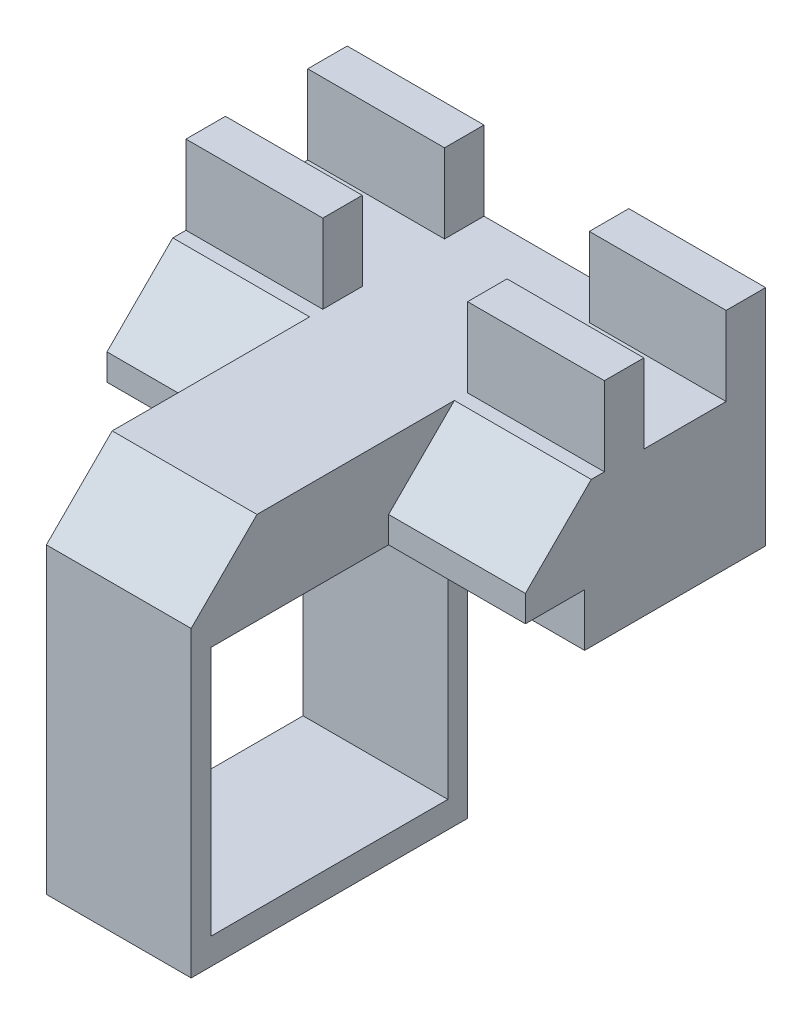
ISO-10303-21;
HEADER;
FILE_DESCRIPTION(('STEP AP214'),'2;1');
FILE_NAME('part.step','',(''),(''),'','','');
FILE_SCHEMA(('AUTOMOTIVE_DESIGN { 1 0 10303 214 1 1 1 1 }'));
ENDSEC;
DATA;
#1=APPLICATION_CONTEXT('core data for automotive mechanical design processes');
#2=APPLICATION_PROTOCOL_DEFINITION('international standard','automotive_design',2000,#1);
#3=PRODUCT_CONTEXT('',#1,'mechanical');
#4=PRODUCT('Part','Part','',(#3));
#5=PRODUCT_RELATED_PRODUCT_CATEGORY('part','',(#4));
#6=PRODUCT_DEFINITION_FORMATION('','',#4);
#7=PRODUCT_DEFINITION_CONTEXT('part definition',#1,'design');
#8=PRODUCT_DEFINITION('design','',#6,#7);
#9=PRODUCT_DEFINITION_SHAPE('','',#8);
#10=(LENGTH_UNIT() NAMED_UNIT(*) SI_UNIT(.MILLI.,.METRE.));
#11=(NAMED_UNIT(*) PLANE_ANGLE_UNIT() SI_UNIT($,.RADIAN.));
#12=(NAMED_UNIT(*) SI_UNIT($,.STERADIAN.) SOLID_ANGLE_UNIT());
#13=UNCERTAINTY_MEASURE_WITH_UNIT(LENGTH_MEASURE(1.E-05),#10,'distance_accuracy_value','');
#14=(GEOMETRIC_REPRESENTATION_CONTEXT(3) GLOBAL_UNCERTAINTY_ASSIGNED_CONTEXT((#13)) GLOBAL_UNIT_ASSIGNED_CONTEXT((#10,
#11,#12)) REPRESENTATION_CONTEXT('',''));
#15=CARTESIAN_POINT('',(0.,0.,0.));
#16=DIRECTION('',(0.,0.,1.));
#17=DIRECTION('',(1.,0.,0.));
#18=AXIS2_PLACEMENT_3D('',#15,#16,#17);
#19=CARTESIAN_POINT('',(43.7350442610288,23.,0.));
#20=DIRECTION('',(1.,0.,0.));
#21=DIRECTION('',(0.,0.,-1.));
#22=AXIS2_PLACEMENT_3D('',#19,#20,#21);
#23=PLANE('',#22);
#24=DIRECTION('',(0.,-1.,0.));
#25=VECTOR('',#24,1.);
#26=CARTESIAN_POINT('',(43.7350442610288,23.,12.5));
#27=LINE('',#26,#25);
#28=CARTESIAN_POINT('',(43.7350442610288,23.,12.5));
#29=VERTEX_POINT('',#28);
#30=CARTESIAN_POINT('',(43.7350442610288,11.,12.5));
#31=VERTEX_POINT('',#30);
#32=EDGE_CURVE('E318',#29,#31,#27,.T.);
#33=ORIENTED_EDGE('',*,*,#32,.T.);
#34=DIRECTION('',(0.,0.,-1.));
#35=VECTOR('',#34,1.);
#36=CARTESIAN_POINT('',(43.7350442610288,11.,18.5));
#37=LINE('',#36,#35);
#38=CARTESIAN_POINT('',(43.7350442610288,11.,18.5));
#39=VERTEX_POINT('',#38);
#40=EDGE_CURVE('E309',#39,#31,#37,.T.);
#41=ORIENTED_EDGE('',*,*,#40,.F.);
#42=DIRECTION('',(0.,-1.,0.));
#43=VECTOR('',#42,1.);
#44=CARTESIAN_POINT('',(43.7350442610288,23.,18.5));
#45=LINE('',#44,#43);
#46=CARTESIAN_POINT('',(43.7350442610288,23.,18.5));
#47=VERTEX_POINT('',#46);
#48=EDGE_CURVE('E308',#47,#39,#45,.T.);
#49=ORIENTED_EDGE('',*,*,#48,.F.);
#50=DIRECTION('',(0.,0.,1.));
#51=VECTOR('',#50,1.);
#52=CARTESIAN_POINT('',(43.7350442610288,23.,0.));
#53=LINE('',#52,#51);
#54=EDGE_CURVE('E325',#29,#47,#53,.T.);
#55=ORIENTED_EDGE('',*,*,#54,.F.);
#56=EDGE_LOOP('',(#33,#41,#49,#55));
#57=FACE_BOUND('',#56,.T.);
#58=ADVANCED_FACE('F71',(#57),#23,.F.);
#59=DIRECTION('',(0.,1.,0.));
#60=VECTOR('',#59,1.);
#61=CARTESIAN_POINT('',(43.7350442610288,-11.,-6.));
#62=LINE('',#61,#60);
#63=CARTESIAN_POINT('',(43.7350442610288,11.,-6.));
#64=VERTEX_POINT('',#63);
#65=CARTESIAN_POINT('',(43.7350442610288,23.,-6.));
#66=VERTEX_POINT('',#65);
#67=EDGE_CURVE('E389',#64,#66,#62,.T.);
#68=ORIENTED_EDGE('',*,*,#67,.F.);
#69=DIRECTION('',(0.,0.,-1.));
#70=VECTOR('',#69,1.);
#71=CARTESIAN_POINT('',(43.7350442610288,11.,0.));
#72=LINE('',#71,#70);
#73=CARTESIAN_POINT('',(43.7350442610288,11.,0.));
#74=VERTEX_POINT('',#73);
#75=EDGE_CURVE('E544',#74,#64,#72,.T.);
#76=ORIENTED_EDGE('',*,*,#75,.F.);
#77=DIRECTION('',(0.,-1.,0.));
#78=VECTOR('',#77,1.);
#79=CARTESIAN_POINT('',(43.7350442610288,23.,0.));
#80=LINE('',#79,#78);
#81=CARTESIAN_POINT('',(43.7350442610288,23.,0.));
#82=VERTEX_POINT('',#81);
#83=EDGE_CURVE('E599',#82,#74,#80,.T.);
#84=ORIENTED_EDGE('',*,*,#83,.F.);
#85=DIRECTION('',(0.,0.,1.));
#86=VECTOR('',#85,1.);
#87=CARTESIAN_POINT('',(43.7350442610288,23.,0.));
#88=LINE('',#87,#86);
#89=EDGE_CURVE('E578',#66,#82,#88,.T.);
#90=ORIENTED_EDGE('',*,*,#89,.F.);
#91=EDGE_LOOP('',(#68,#76,#84,#90));
#92=FACE_BOUND('',#91,.T.);
#93=ADVANCED_FACE('F734',(#92),#23,.F.);
#94=CARTESIAN_POINT('',(21.7350442610289,23.,0.));
#95=DIRECTION('',(1.,0.,0.));
#96=DIRECTION('',(0.,0.,-1.));
#97=AXIS2_PLACEMENT_3D('',#94,#95,#96);
#98=PLANE('',#97);
#99=DIRECTION('',(0.,0.,1.));
#100=VECTOR('',#99,1.);
#101=CARTESIAN_POINT('',(21.7350442610289,11.,12.5));
#102=LINE('',#101,#100);
#103=CARTESIAN_POINT('',(21.7350442610289,11.,12.5));
#104=VERTEX_POINT('',#103);
#105=CARTESIAN_POINT('',(21.7350442610289,11.,18.5));
#106=VERTEX_POINT('',#105);
#107=EDGE_CURVE('E561',#104,#106,#102,.T.);
#108=ORIENTED_EDGE('',*,*,#107,.F.);
#109=DIRECTION('',(0.,-1.,0.));
#110=VECTOR('',#109,1.);
#111=CARTESIAN_POINT('',(21.7350442610289,23.,12.5));
#112=LINE('',#111,#110);
#113=CARTESIAN_POINT('',(21.7350442610289,23.,12.5));
#114=VERTEX_POINT('',#113);
#115=EDGE_CURVE('E450',#114,#104,#112,.T.);
#116=ORIENTED_EDGE('',*,*,#115,.F.);
#117=DIRECTION('',(0.,0.,1.));
#118=VECTOR('',#117,1.);
#119=CARTESIAN_POINT('',(21.7350442610289,23.,0.));
#120=LINE('',#119,#118);
#121=CARTESIAN_POINT('',(21.7350442610289,23.,18.5));
#122=VERTEX_POINT('',#121);
#123=EDGE_CURVE('E426',#114,#122,#120,.T.);
#124=ORIENTED_EDGE('',*,*,#123,.T.);
#125=DIRECTION('',(0.,-1.,0.));
#126=VECTOR('',#125,1.);
#127=CARTESIAN_POINT('',(21.7350442610289,23.,18.5));
#128=LINE('',#127,#126);
#129=EDGE_CURVE('E452',#122,#106,#128,.T.);
#130=ORIENTED_EDGE('',*,*,#129,.T.);
#131=EDGE_LOOP('',(#108,#116,#124,#130));
#132=FACE_BOUND('',#131,.T.);
#133=ADVANCED_FACE('F700',(#132),#98,.T.);
#134=DIRECTION('',(0.,0.,1.));
#135=VECTOR('',#134,1.);
#136=CARTESIAN_POINT('',(21.7350442610289,11.,-6.));
#137=LINE('',#136,#135);
#138=CARTESIAN_POINT('',(21.7350442610289,11.,-6.));
#139=VERTEX_POINT('',#138);
#140=CARTESIAN_POINT('',(21.7350442610289,11.,0.));
#141=VERTEX_POINT('',#140);
#142=EDGE_CURVE('E549',#139,#141,#137,.T.);
#143=ORIENTED_EDGE('',*,*,#142,.F.);
#144=DIRECTION('',(0.,-1.,0.));
#145=VECTOR('',#144,1.);
#146=CARTESIAN_POINT('',(21.7350442610289,23.,-6.));
#147=LINE('',#146,#145);
#148=CARTESIAN_POINT('',(21.7350442610289,23.,-6.));
#149=VERTEX_POINT('',#148);
#150=EDGE_CURVE('E501',#149,#139,#147,.T.);
#151=ORIENTED_EDGE('',*,*,#150,.F.);
#152=DIRECTION('',(0.,0.,1.));
#153=VECTOR('',#152,1.);
#154=CARTESIAN_POINT('',(21.7350442610289,23.,0.));
#155=LINE('',#154,#153);
#156=CARTESIAN_POINT('',(21.7350442610289,23.,0.));
#157=VERTEX_POINT('',#156);
#158=EDGE_CURVE('E475',#149,#157,#155,.T.);
#159=ORIENTED_EDGE('',*,*,#158,.T.);
#160=DIRECTION('',(0.,-1.,0.));
#161=VECTOR('',#160,1.);
#162=CARTESIAN_POINT('',(21.7350442610289,23.,0.));
#163=LINE('',#162,#161);
#164=EDGE_CURVE('E489',#157,#141,#163,.T.);
#165=ORIENTED_EDGE('',*,*,#164,.T.);
#166=EDGE_LOOP('',(#143,#151,#159,#165));
#167=FACE_BOUND('',#166,.T.);
#168=ADVANCED_FACE('F740',(#167),#98,.T.);
#169=CARTESIAN_POINT('',(64.5250246392808,23.,0.));
#170=DIRECTION('',(1.,0.,0.));
#171=DIRECTION('',(0.,0.,-1.));
#172=AXIS2_PLACEMENT_3D('',#169,#170,#171);
#173=PLANE('',#172);
#174=DIRECTION('',(0.,0.,-1.));
#175=VECTOR('',#174,1.);
#176=CARTESIAN_POINT('',(64.5250246392808,11.,30.5));
#177=LINE('',#176,#175);
#178=CARTESIAN_POINT('',(64.5250246392808,11.,20.5));
#179=VERTEX_POINT('',#178);
#180=CARTESIAN_POINT('',(64.5250246392808,11.,18.5));
#181=VERTEX_POINT('',#180);
#182=EDGE_CURVE('E289',#179,#181,#177,.T.);
#183=ORIENTED_EDGE('',*,*,#182,.F.);
#184=DIRECTION('',(0.,-0.707106781186549,0.707106781186546));
#185=VECTOR('',#184,1.);
#186=CARTESIAN_POINT('',(64.5250246392808,27.25,4.25000000000003));
#187=LINE('',#186,#185);
#188=CARTESIAN_POINT('',(64.5250246392808,0.999999999999944,30.5));
#189=VERTEX_POINT('',#188);
#190=EDGE_CURVE('E344',#179,#189,#187,.T.);
#191=ORIENTED_EDGE('',*,*,#190,.T.);
#192=DIRECTION('',(0.,1.,0.));
#193=VECTOR('',#192,1.);
#194=CARTESIAN_POINT('',(64.5250246392808,-11.,30.5));
#195=LINE('',#194,#193);
#196=CARTESIAN_POINT('',(64.5250246392808,-3.,30.5));
#197=VERTEX_POINT('',#196);
#198=EDGE_CURVE('E376',#197,#189,#195,.T.);
#199=ORIENTED_EDGE('',*,*,#198,.F.);
#200=DIRECTION('',(0.,0.,1.));
#201=VECTOR('',#200,1.);
#202=CARTESIAN_POINT('',(64.5250246392808,-3.,0.));
#203=LINE('',#202,#201);
#204=CARTESIAN_POINT('',(64.5250246392808,-3.,21.5));
#205=VERTEX_POINT('',#204);
#206=EDGE_CURVE('E642',#205,#197,#203,.T.);
#207=ORIENTED_EDGE('',*,*,#206,.F.);
#208=DIRECTION('',(0.,-1.,0.));
#209=VECTOR('',#208,1.);
#210=CARTESIAN_POINT('',(64.5250246392808,-11.,21.5));
#211=LINE('',#210,#209);
#212=CARTESIAN_POINT('',(64.5250246392808,-11.,21.5));
#213=VERTEX_POINT('',#212);
#214=EDGE_CURVE('E612',#205,#213,#211,.T.);
#215=ORIENTED_EDGE('',*,*,#214,.T.);
#216=DIRECTION('',(0.,0.,1.));
#217=VECTOR('',#216,1.);
#218=CARTESIAN_POINT('',(64.5250246392808,-11.,0.));
#219=LINE('',#218,#217);
#220=CARTESIAN_POINT('',(64.5250246392808,-11.,-6.00000000000001));
#221=VERTEX_POINT('',#220);
#222=EDGE_CURVE('E396',#221,#213,#219,.T.);
#223=ORIENTED_EDGE('',*,*,#222,.F.);
#224=DIRECTION('',(0.,1.,0.));
#225=VECTOR('',#224,1.);
#226=CARTESIAN_POINT('',(64.5250246392808,-11.,-6.00000000000001));
#227=LINE('',#226,#225);
#228=CARTESIAN_POINT('',(64.5250246392808,23.,-6.00000000000001));
#229=VERTEX_POINT('',#228);
#230=EDGE_CURVE('E398',#221,#229,#227,.T.);
#231=ORIENTED_EDGE('',*,*,#230,.T.);
#232=DIRECTION('',(0.,0.,1.));
#233=VECTOR('',#232,1.);
#234=CARTESIAN_POINT('',(64.5250246392808,23.,0.));
#235=LINE('',#234,#233);
#236=CARTESIAN_POINT('',(64.5250246392808,23.,0.));
#237=VERTEX_POINT('',#236);
#238=EDGE_CURVE('E587',#229,#237,#235,.T.);
#239=ORIENTED_EDGE('',*,*,#238,.T.);
#240=DIRECTION('',(0.,-1.,0.));
#241=VECTOR('',#240,1.);
#242=CARTESIAN_POINT('',(64.5250246392808,23.,0.));
#243=LINE('',#242,#241);
#244=CARTESIAN_POINT('',(64.5250246392808,11.,0.));
#245=VERTEX_POINT('',#244);
#246=EDGE_CURVE('E592',#237,#245,#243,.T.);
#247=ORIENTED_EDGE('',*,*,#246,.T.);
#248=DIRECTION('',(0.,0.,-1.));
#249=VECTOR('',#248,1.);
#250=CARTESIAN_POINT('',(64.5250246392808,11.,12.5));
#251=LINE('',#250,#249);
#252=CARTESIAN_POINT('',(64.5250246392808,11.,12.5));
#253=VERTEX_POINT('',#252);
#254=EDGE_CURVE('E533',#253,#245,#251,.T.);
#255=ORIENTED_EDGE('',*,*,#254,.F.);
#256=DIRECTION('',(0.,-1.,0.));
#257=VECTOR('',#256,1.);
#258=CARTESIAN_POINT('',(64.5250246392808,23.,12.5));
#259=LINE('',#258,#257);
#260=CARTESIAN_POINT('',(64.5250246392808,23.,12.5));
#261=VERTEX_POINT('',#260);
#262=EDGE_CURVE('E328',#261,#253,#259,.T.);
#263=ORIENTED_EDGE('',*,*,#262,.F.);
#264=DIRECTION('',(0.,0.,1.));
#265=VECTOR('',#264,1.);
#266=CARTESIAN_POINT('',(64.5250246392808,23.,0.));
#267=LINE('',#266,#265);
#268=CARTESIAN_POINT('',(64.5250246392808,23.,18.5));
#269=VERTEX_POINT('',#268);
#270=EDGE_CURVE('E313',#261,#269,#267,.T.);
#271=ORIENTED_EDGE('',*,*,#270,.T.);
#272=DIRECTION('',(0.,-1.,0.));
#273=VECTOR('',#272,1.);
#274=CARTESIAN_POINT('',(64.5250246392808,23.,18.5));
#275=LINE('',#274,#273);
#276=EDGE_CURVE('E304',#269,#181,#275,.T.);
#277=ORIENTED_EDGE('',*,*,#276,.T.);
#278=EDGE_LOOP('',(#183,#191,#199,#207,#215,#223,#231,#239,#247,#255,#263,#271,#277));
#279=FACE_BOUND('',#278,.T.);
#280=ADVANCED_FACE('F315',(#279),#173,.T.);
#281=CARTESIAN_POINT('',(0.,23.,12.5));
#282=DIRECTION('',(0.,0.,1.));
#283=DIRECTION('',(1.,0.,0.));
#284=AXIS2_PLACEMENT_3D('',#281,#282,#283);
#285=PLANE('',#284);
#286=ORIENTED_EDGE('',*,*,#262,.T.);
#287=DIRECTION('',(1.,0.,0.));
#288=VECTOR('',#287,1.);
#289=CARTESIAN_POINT('',(43.7350442610288,11.,12.5));
#290=LINE('',#289,#288);
#291=EDGE_CURVE('E535',#31,#253,#290,.T.);
#292=ORIENTED_EDGE('',*,*,#291,.F.);
#293=ORIENTED_EDGE('',*,*,#32,.F.);
#294=DIRECTION('',(-1.,0.,0.));
#295=VECTOR('',#294,1.);
#296=CARTESIAN_POINT('',(0.,23.,12.5));
#297=LINE('',#296,#295);
#298=EDGE_CURVE('E521',#261,#29,#297,.T.);
#299=ORIENTED_EDGE('',*,*,#298,.F.);
#300=EDGE_LOOP('',(#286,#292,#293,#299));
#301=FACE_BOUND('',#300,.T.);
#302=ADVANCED_FACE('F742',(#301),#285,.F.);
#303=CARTESIAN_POINT('',(0.,23.,18.5));
#304=DIRECTION('',(0.,0.,-1.));
#305=DIRECTION('',(-1.,0.,0.));
#306=AXIS2_PLACEMENT_3D('',#303,#304,#305);
#307=PLANE('',#306);
#308=ORIENTED_EDGE('',*,*,#48,.T.);
#309=DIRECTION('',(-1.,0.,0.));
#310=VECTOR('',#309,1.);
#311=CARTESIAN_POINT('',(64.5250246392808,11.,18.5));
#312=LINE('',#311,#310);
#313=EDGE_CURVE('E292',#181,#39,#312,.T.);
#314=ORIENTED_EDGE('',*,*,#313,.F.);
#315=ORIENTED_EDGE('',*,*,#276,.F.);
#316=DIRECTION('',(1.,0.,0.));
#317=VECTOR('',#316,1.);
#318=CARTESIAN_POINT('',(0.,23.,18.5));
#319=LINE('',#318,#317);
#320=EDGE_CURVE('E317',#47,#269,#319,.T.);
#321=ORIENTED_EDGE('',*,*,#320,.F.);
#322=EDGE_LOOP('',(#308,#314,#315,#321));
#323=FACE_BOUND('',#322,.T.);
#324=ADVANCED_FACE('F303',(#323),#307,.F.);
#325=CARTESIAN_POINT('',(0.,23.,0.));
#326=DIRECTION('',(0.,1.,0.));
#327=DIRECTION('',(0.,0.,1.));
#328=AXIS2_PLACEMENT_3D('',#325,#326,#327);
#329=PLANE('',#328);
#330=ORIENTED_EDGE('',*,*,#270,.F.);
#331=ORIENTED_EDGE('',*,*,#298,.T.);
#332=ORIENTED_EDGE('',*,*,#54,.T.);
#333=ORIENTED_EDGE('',*,*,#320,.T.);
#334=EDGE_LOOP('',(#330,#331,#332,#333));
#335=FACE_BOUND('',#334,.T.);
#336=ADVANCED_FACE('F528',(#335),#329,.T.);
#337=CARTESIAN_POINT('',(0.945063882776893,23.,0.));
#338=DIRECTION('',(-1.,0.,0.));
#339=DIRECTION('',(0.,0.,1.));
#340=AXIS2_PLACEMENT_3D('',#337,#338,#339);
#341=PLANE('',#340);
#342=DIRECTION('',(0.,1.,0.));
#343=VECTOR('',#342,1.);
#344=CARTESIAN_POINT('',(0.945063882776898,-11.,30.5));
#345=LINE('',#344,#343);
#346=CARTESIAN_POINT('',(0.945063882776862,-3.,30.5));
#347=VERTEX_POINT('',#346);
#348=CARTESIAN_POINT('',(0.945063882776898,0.99999999999993,30.5));
#349=VERTEX_POINT('',#348);
#350=EDGE_CURVE('E456',#347,#349,#345,.T.);
#351=ORIENTED_EDGE('',*,*,#350,.T.);
#352=DIRECTION('',(0.,-0.707106781186549,0.707106781186546));
#353=VECTOR('',#352,1.);
#354=CARTESIAN_POINT('',(0.945063882776893,27.25,4.25000000000003));
#355=LINE('',#354,#353);
#356=CARTESIAN_POINT('',(0.945063882776896,11.,20.5));
#357=VERTEX_POINT('',#356);
#358=EDGE_CURVE('E355',#349,#357,#355,.F.);
#359=ORIENTED_EDGE('',*,*,#358,.T.);
#360=DIRECTION('',(0.,0.,1.));
#361=VECTOR('',#360,1.);
#362=CARTESIAN_POINT('',(0.945063882776895,11.,18.5));
#363=LINE('',#362,#361);
#364=CARTESIAN_POINT('',(0.945063882776895,11.,18.5));
#365=VERTEX_POINT('',#364);
#366=EDGE_CURVE('E570',#365,#357,#363,.T.);
#367=ORIENTED_EDGE('',*,*,#366,.F.);
#368=DIRECTION('',(0.,-1.,0.));
#369=VECTOR('',#368,1.);
#370=CARTESIAN_POINT('',(0.945063882776895,23.,18.5));
#371=LINE('',#370,#369);
#372=CARTESIAN_POINT('',(0.945063882776895,23.,18.5));
#373=VERTEX_POINT('',#372);
#374=EDGE_CURVE('E437',#373,#365,#371,.T.);
#375=ORIENTED_EDGE('',*,*,#374,.F.);
#376=DIRECTION('',(0.,0.,1.));
#377=VECTOR('',#376,1.);
#378=CARTESIAN_POINT('',(0.945063882776893,23.,0.));
#379=LINE('',#378,#377);
#380=CARTESIAN_POINT('',(0.945063882776894,23.,12.5));
#381=VERTEX_POINT('',#380);
#382=EDGE_CURVE('E436',#381,#373,#379,.T.);
#383=ORIENTED_EDGE('',*,*,#382,.F.);
#384=DIRECTION('',(0.,-1.,0.));
#385=VECTOR('',#384,1.);
#386=CARTESIAN_POINT('',(0.945063882776894,23.,12.5));
#387=LINE('',#386,#385);
#388=CARTESIAN_POINT('',(0.945063882776894,11.,12.5));
#389=VERTEX_POINT('',#388);
#390=EDGE_CURVE('E442',#381,#389,#387,.T.);
#391=ORIENTED_EDGE('',*,*,#390,.T.);
#392=DIRECTION('',(0.,0.,1.));
#393=VECTOR('',#392,1.);
#394=CARTESIAN_POINT('',(0.945063882776891,11.,0.));
#395=LINE('',#394,#393);
#396=CARTESIAN_POINT('',(0.945063882776891,11.,0.));
#397=VERTEX_POINT('',#396);
#398=EDGE_CURVE('E554',#397,#389,#395,.T.);
#399=ORIENTED_EDGE('',*,*,#398,.F.);
#400=DIRECTION('',(0.,-1.,0.));
#401=VECTOR('',#400,1.);
#402=CARTESIAN_POINT('',(0.945063882776893,23.,0.));
#403=LINE('',#402,#401);
#404=CARTESIAN_POINT('',(0.945063882776893,23.,0.));
#405=VERTEX_POINT('',#404);
#406=EDGE_CURVE('E494',#405,#397,#403,.T.);
#407=ORIENTED_EDGE('',*,*,#406,.F.);
#408=DIRECTION('',(0.,0.,-1.));
#409=VECTOR('',#408,1.);
#410=CARTESIAN_POINT('',(0.945063882776893,23.,0.));
#411=LINE('',#410,#409);
#412=CARTESIAN_POINT('',(0.945063882776893,23.,-6.));
#413=VERTEX_POINT('',#412);
#414=EDGE_CURVE('E485',#405,#413,#411,.T.);
#415=ORIENTED_EDGE('',*,*,#414,.T.);
#416=DIRECTION('',(0.,-1.,0.));
#417=VECTOR('',#416,1.);
#418=CARTESIAN_POINT('',(0.945063882776893,23.,-6.));
#419=LINE('',#418,#417);
#420=CARTESIAN_POINT('',(0.945063882776893,-11.,-6.));
#421=VERTEX_POINT('',#420);
#422=EDGE_CURVE('E498',#413,#421,#419,.T.);
#423=ORIENTED_EDGE('',*,*,#422,.T.);
#424=DIRECTION('',(0.,0.,1.));
#425=VECTOR('',#424,1.);
#426=CARTESIAN_POINT('',(0.945063882776895,-11.,18.5));
#427=LINE('',#426,#425);
#428=CARTESIAN_POINT('',(0.945063882776875,-11.,21.4999999999999));
#429=VERTEX_POINT('',#428);
#430=EDGE_CURVE('E460',#421,#429,#427,.T.);
#431=ORIENTED_EDGE('',*,*,#430,.T.);
#432=DIRECTION('',(0.,1.,0.));
#433=VECTOR('',#432,1.);
#434=CARTESIAN_POINT('',(0.945063882776875,0.,21.4999999999999));
#435=LINE('',#434,#433);
#436=CARTESIAN_POINT('',(0.945063882776875,-3.,21.4999999999999));
#437=VERTEX_POINT('',#436);
#438=EDGE_CURVE('E604',#429,#437,#435,.T.);
#439=ORIENTED_EDGE('',*,*,#438,.T.);
#440=DIRECTION('',(0.,0.,-1.));
#441=VECTOR('',#440,1.);
#442=CARTESIAN_POINT('',(0.945063882776889,-3.,0.));
#443=LINE('',#442,#441);
#444=EDGE_CURVE('E607',#347,#437,#443,.T.);
#445=ORIENTED_EDGE('',*,*,#444,.F.);
#446=EDGE_LOOP('',(#351,#359,#367,#375,#383,#391,#399,#407,#415,#423,#431,#439,#445));
#447=FACE_BOUND('',#446,.T.);
#448=ADVANCED_FACE('F679',(#447),#341,.T.);
#449=CARTESIAN_POINT('',(0.945063882776898,-11.,30.5));
#450=DIRECTION('',(0.,0.,1.));
#451=DIRECTION('',(1.,0.,0.));
#452=AXIS2_PLACEMENT_3D('',#449,#450,#451);
#453=PLANE('',#452);
#454=DIRECTION('',(0.,1.,0.));
#455=VECTOR('',#454,1.);
#456=CARTESIAN_POINT('',(21.7350442610289,-11.,30.5));
#457=LINE('',#456,#455);
#458=CARTESIAN_POINT('',(21.7350442610289,-3.,30.5));
#459=VERTEX_POINT('',#458);
#460=CARTESIAN_POINT('',(21.7350442610289,0.99999999999993,30.5));
#461=VERTEX_POINT('',#460);
#462=EDGE_CURVE('E463',#459,#461,#457,.T.);
#463=ORIENTED_EDGE('',*,*,#462,.T.);
#464=DIRECTION('',(-1.,0.,0.));
#465=VECTOR('',#464,1.);
#466=CARTESIAN_POINT('',(0.945063882776898,0.99999999999993,30.5));
#467=LINE('',#466,#465);
#468=EDGE_CURVE('E348',#461,#349,#467,.T.);
#469=ORIENTED_EDGE('',*,*,#468,.T.);
#470=ORIENTED_EDGE('',*,*,#350,.F.);
#471=DIRECTION('',(1.,0.,0.));
#472=VECTOR('',#471,1.);
#473=CARTESIAN_POINT('',(0.945063882776898,-3.,30.5));
#474=LINE('',#473,#472);
#475=EDGE_CURVE('E648',#347,#459,#474,.T.);
#476=ORIENTED_EDGE('',*,*,#475,.T.);
#477=EDGE_LOOP('',(#463,#469,#470,#476));
#478=FACE_BOUND('',#477,.T.);
#479=ADVANCED_FACE('F682',(#478),#453,.T.);
#480=CARTESIAN_POINT('',(0.,-11.,30.5));
#481=DIRECTION('',(0.,0.,-1.));
#482=DIRECTION('',(-1.,0.,0.));
#483=AXIS2_PLACEMENT_3D('',#480,#481,#482);
#484=PLANE('',#483);
#485=ORIENTED_EDGE('',*,*,#198,.T.);
#486=DIRECTION('',(-1.,0.,0.));
#487=VECTOR('',#486,1.);
#488=CARTESIAN_POINT('',(43.7350442610289,0.999999999999944,30.5));
#489=LINE('',#488,#487);
#490=CARTESIAN_POINT('',(43.7350442610289,0.999999999999944,30.5));
#491=VERTEX_POINT('',#490);
#492=EDGE_CURVE('E346',#189,#491,#489,.T.);
#493=ORIENTED_EDGE('',*,*,#492,.T.);
#494=DIRECTION('',(0.,1.,0.));
#495=VECTOR('',#494,1.);
#496=CARTESIAN_POINT('',(43.7350442610289,-11.,30.5));
#497=LINE('',#496,#495);
#498=CARTESIAN_POINT('',(43.7350442610289,-3.,30.5));
#499=VERTEX_POINT('',#498);
#500=EDGE_CURVE('E367',#499,#491,#497,.T.);
#501=ORIENTED_EDGE('',*,*,#500,.F.);
#502=DIRECTION('',(-1.,0.,0.));
#503=VECTOR('',#502,1.);
#504=CARTESIAN_POINT('',(0.,-3.,30.5));
#505=LINE('',#504,#503);
#506=EDGE_CURVE('E379',#197,#499,#505,.T.);
#507=ORIENTED_EDGE('',*,*,#506,.F.);
#508=EDGE_LOOP('',(#485,#493,#501,#507));
#509=FACE_BOUND('',#508,.T.);
#510=ADVANCED_FACE('F378',(#509),#484,.F.);
#511=CARTESIAN_POINT('',(43.7350442610289,-45.,0.));
#512=DIRECTION('',(1.,0.,0.));
#513=DIRECTION('',(0.,0.,-1.));
#514=AXIS2_PLACEMENT_3D('',#511,#512,#513);
#515=PLANE('',#514);
#516=DIRECTION('',(0.,0.,-1.));
#517=VECTOR('',#516,1.);
#518=CARTESIAN_POINT('',(43.7350442610289,11.,60.5));
#519=LINE('',#518,#517);
#520=CARTESIAN_POINT('',(43.7350442610289,11.,50.5));
#521=VERTEX_POINT('',#520);
#522=CARTESIAN_POINT('',(43.7350442610289,11.,20.5));
#523=VERTEX_POINT('',#522);
#524=EDGE_CURVE('E366',#521,#523,#519,.T.);
#525=ORIENTED_EDGE('',*,*,#524,.F.);
#526=DIRECTION('',(0.,0.707106781186549,-0.707106781186546));
#527=VECTOR('',#526,1.);
#528=CARTESIAN_POINT('',(43.7350442610289,8.24999999999987,53.2500000000001));
#529=LINE('',#528,#527);
#530=CARTESIAN_POINT('',(43.7350442610289,0.999999999999918,60.5));
#531=VERTEX_POINT('',#530);
#532=EDGE_CURVE('E96',#521,#531,#529,.F.);
#533=ORIENTED_EDGE('',*,*,#532,.T.);
#534=DIRECTION('',(0.,1.,0.));
#535=VECTOR('',#534,1.);
#536=CARTESIAN_POINT('',(43.7350442610289,-45.,60.5));
#537=LINE('',#536,#535);
#538=CARTESIAN_POINT('',(43.7350442610289,-45.,60.5));
#539=VERTEX_POINT('',#538);
#540=EDGE_CURVE('E418',#539,#531,#537,.T.);
#541=ORIENTED_EDGE('',*,*,#540,.F.);
#542=DIRECTION('',(0.,0.,-1.));
#543=VECTOR('',#542,1.);
#544=CARTESIAN_POINT('',(43.7350442610289,-45.,0.));
#545=LINE('',#544,#543);
#546=CARTESIAN_POINT('',(43.7350442610288,-45.,18.5));
#547=VERTEX_POINT('',#546);
#548=EDGE_CURVE('E407',#539,#547,#545,.T.);
#549=ORIENTED_EDGE('',*,*,#548,.T.);
#550=DIRECTION('',(0.,1.,0.));
#551=VECTOR('',#550,1.);
#552=CARTESIAN_POINT('',(43.7350442610288,-45.,18.5));
#553=LINE('',#552,#551);
#554=CARTESIAN_POINT('',(43.7350442610288,-11.,18.5));
#555=VERTEX_POINT('',#554);
#556=EDGE_CURVE('E411',#547,#555,#553,.T.);
#557=ORIENTED_EDGE('',*,*,#556,.T.);
#558=DIRECTION('',(0.,0.,1.));
#559=VECTOR('',#558,1.);
#560=CARTESIAN_POINT('',(43.7350442610288,-11.,0.));
#561=LINE('',#560,#559);
#562=CARTESIAN_POINT('',(43.7350442610288,-11.,21.5));
#563=VERTEX_POINT('',#562);
#564=EDGE_CURVE('E391',#555,#563,#561,.T.);
#565=ORIENTED_EDGE('',*,*,#564,.T.);
#566=DIRECTION('',(0.,1.,0.));
#567=VECTOR('',#566,1.);
#568=CARTESIAN_POINT('',(43.7350442610289,-45.,21.4999999999999));
#569=LINE('',#568,#567);
#570=CARTESIAN_POINT('',(43.7350442610289,-41.,21.4999999999999));
#571=VERTEX_POINT('',#570);
#572=EDGE_CURVE('E629',#571,#563,#569,.T.);
#573=ORIENTED_EDGE('',*,*,#572,.F.);
#574=DIRECTION('',(0.,0.,-1.));
#575=VECTOR('',#574,1.);
#576=CARTESIAN_POINT('',(43.7350442610289,-41.,0.));
#577=LINE('',#576,#575);
#578=CARTESIAN_POINT('',(43.7350442610289,-41.,57.4999999999999));
#579=VERTEX_POINT('',#578);
#580=EDGE_CURVE('E656',#579,#571,#577,.T.);
#581=ORIENTED_EDGE('',*,*,#580,.F.);
#582=DIRECTION('',(0.,1.,0.));
#583=VECTOR('',#582,1.);
#584=CARTESIAN_POINT('',(43.7350442610289,-45.,57.4999999999999));
#585=LINE('',#584,#583);
#586=CARTESIAN_POINT('',(43.7350442610289,-3.,57.4999999999999));
#587=VERTEX_POINT('',#586);
#588=EDGE_CURVE('E653',#579,#587,#585,.T.);
#589=ORIENTED_EDGE('',*,*,#588,.T.);
#590=DIRECTION('',(0.,0.,-1.));
#591=VECTOR('',#590,1.);
#592=CARTESIAN_POINT('',(43.7350442610289,-3.,0.));
#593=LINE('',#592,#591);
#594=EDGE_CURVE('E641',#587,#499,#593,.T.);
#595=ORIENTED_EDGE('',*,*,#594,.T.);
#596=ORIENTED_EDGE('',*,*,#500,.T.);
#597=DIRECTION('',(0.,0.707106781186549,-0.707106781186546));
#598=VECTOR('',#597,1.);
#599=CARTESIAN_POINT('',(43.7350442610289,11.,20.5));
#600=LINE('',#599,#598);
#601=EDGE_CURVE('E84',#491,#523,#600,.T.);
#602=ORIENTED_EDGE('',*,*,#601,.T.);
#603=EDGE_LOOP('',(#525,#533,#541,#549,#557,#565,#573,#581,#589,#595,#596,#602));
#604=FACE_BOUND('',#603,.T.);
#605=ADVANCED_FACE('F362',(#604),#515,.T.);
#606=CARTESIAN_POINT('',(0.,23.,-6.));
#607=DIRECTION('',(0.,0.,-1.));
#608=DIRECTION('',(-1.,0.,0.));
#609=AXIS2_PLACEMENT_3D('',#606,#607,#608);
#610=PLANE('',#609);
#611=DIRECTION('',(-1.,0.,0.));
#612=VECTOR('',#611,1.);
#613=CARTESIAN_POINT('',(43.7350442610288,11.,-6.));
#614=LINE('',#613,#612);
#615=EDGE_CURVE('E548',#64,#139,#614,.T.);
#616=ORIENTED_EDGE('',*,*,#615,.F.);
#617=ORIENTED_EDGE('',*,*,#67,.T.);
#618=DIRECTION('',(-1.,0.,0.));
#619=VECTOR('',#618,1.);
#620=CARTESIAN_POINT('',(0.,23.,-5.99999999999999));
#621=LINE('',#620,#619);
#622=EDGE_CURVE('E593',#229,#66,#621,.T.);
#623=ORIENTED_EDGE('',*,*,#622,.F.);
#624=ORIENTED_EDGE('',*,*,#230,.F.);
#625=DIRECTION('',(1.,0.,0.));
#626=VECTOR('',#625,1.);
#627=CARTESIAN_POINT('',(0.,-11.,-6.));
#628=LINE('',#627,#626);
#629=EDGE_CURVE('E453',#421,#221,#628,.T.);
#630=ORIENTED_EDGE('',*,*,#629,.F.);
#631=ORIENTED_EDGE('',*,*,#422,.F.);
#632=DIRECTION('',(1.,0.,0.));
#633=VECTOR('',#632,1.);
#634=CARTESIAN_POINT('',(0.,23.,-6.));
#635=LINE('',#634,#633);
#636=EDGE_CURVE('E479',#413,#149,#635,.T.);
#637=ORIENTED_EDGE('',*,*,#636,.T.);
#638=ORIENTED_EDGE('',*,*,#150,.T.);
#639=EDGE_LOOP('',(#616,#617,#623,#624,#630,#631,#637,#638));
#640=FACE_BOUND('',#639,.T.);
#641=ADVANCED_FACE('F718',(#640),#610,.T.);
#642=CARTESIAN_POINT('',(0.,23.,0.));
#643=DIRECTION('',(0.,0.,1.));
#644=DIRECTION('',(1.,0.,0.));
#645=AXIS2_PLACEMENT_3D('',#642,#643,#644);
#646=PLANE('',#645);
#647=DIRECTION('',(-1.,0.,0.));
#648=VECTOR('',#647,1.);
#649=CARTESIAN_POINT('',(21.7350442610289,11.,0.));
#650=LINE('',#649,#648);
#651=EDGE_CURVE('E552',#141,#397,#650,.T.);
#652=ORIENTED_EDGE('',*,*,#651,.F.);
#653=ORIENTED_EDGE('',*,*,#164,.F.);
#654=DIRECTION('',(-1.,0.,0.));
#655=VECTOR('',#654,1.);
#656=CARTESIAN_POINT('',(0.,23.,0.));
#657=LINE('',#656,#655);
#658=EDGE_CURVE('E488',#157,#405,#657,.T.);
#659=ORIENTED_EDGE('',*,*,#658,.T.);
#660=ORIENTED_EDGE('',*,*,#406,.T.);
#661=EDGE_LOOP('',(#652,#653,#659,#660));
#662=FACE_BOUND('',#661,.T.);
#663=ADVANCED_FACE('F708',(#662),#646,.T.);
#664=CARTESIAN_POINT('',(0.,23.,0.));
#665=DIRECTION('',(0.,1.,0.));
#666=DIRECTION('',(0.,0.,1.));
#667=AXIS2_PLACEMENT_3D('',#664,#665,#666);
#668=PLANE('',#667);
#669=ORIENTED_EDGE('',*,*,#158,.F.);
#670=ORIENTED_EDGE('',*,*,#636,.F.);
#671=ORIENTED_EDGE('',*,*,#414,.F.);
#672=ORIENTED_EDGE('',*,*,#658,.F.);
#673=EDGE_LOOP('',(#669,#670,#671,#672));
#674=FACE_BOUND('',#673,.T.);
#675=ADVANCED_FACE('F711',(#674),#668,.T.);
#676=CARTESIAN_POINT('',(0.,-11.,0.));
#677=DIRECTION('',(0.,1.,0.));
#678=DIRECTION('',(0.,0.,1.));
#679=AXIS2_PLACEMENT_3D('',#676,#677,#678);
#680=PLANE('',#679);
#681=ORIENTED_EDGE('',*,*,#629,.T.);
#682=ORIENTED_EDGE('',*,*,#222,.T.);
#683=DIRECTION('',(-1.,0.,0.));
#684=VECTOR('',#683,1.);
#685=CARTESIAN_POINT('',(0.,-11.,21.4999999999999));
#686=LINE('',#685,#684);
#687=EDGE_CURVE('E504',#213,#563,#686,.T.);
#688=ORIENTED_EDGE('',*,*,#687,.T.);
#689=ORIENTED_EDGE('',*,*,#564,.F.);
#690=DIRECTION('',(1.,0.,0.));
#691=VECTOR('',#690,1.);
#692=CARTESIAN_POINT('',(1.73504426102884,-11.,18.5));
#693=LINE('',#692,#691);
#694=CARTESIAN_POINT('',(21.7350442610289,-11.,18.5));
#695=VERTEX_POINT('',#694);
#696=EDGE_CURVE('E580',#695,#555,#693,.T.);
#697=ORIENTED_EDGE('',*,*,#696,.F.);
#698=DIRECTION('',(0.,0.,-1.));
#699=VECTOR('',#698,1.);
#700=CARTESIAN_POINT('',(21.7350442610289,-11.,30.5));
#701=LINE('',#700,#699);
#702=CARTESIAN_POINT('',(21.7350442610289,-11.,21.4999999999999));
#703=VERTEX_POINT('',#702);
#704=EDGE_CURVE('E466',#703,#695,#701,.T.);
#705=ORIENTED_EDGE('',*,*,#704,.F.);
#706=DIRECTION('',(-1.,0.,0.));
#707=VECTOR('',#706,1.);
#708=CARTESIAN_POINT('',(0.,-11.,21.4999999999999));
#709=LINE('',#708,#707);
#710=EDGE_CURVE('E640',#703,#429,#709,.T.);
#711=ORIENTED_EDGE('',*,*,#710,.T.);
#712=ORIENTED_EDGE('',*,*,#430,.F.);
#713=EDGE_LOOP('',(#681,#682,#688,#689,#697,#705,#711,#712));
#714=FACE_BOUND('',#713,.T.);
#715=ADVANCED_FACE('F664',(#714),#680,.F.);
#716=CARTESIAN_POINT('',(0.,23.,18.5));
#717=DIRECTION('',(0.,0.,1.));
#718=DIRECTION('',(1.,0.,0.));
#719=AXIS2_PLACEMENT_3D('',#716,#717,#718);
#720=PLANE('',#719);
#721=DIRECTION('',(-1.,0.,0.));
#722=VECTOR('',#721,1.);
#723=CARTESIAN_POINT('',(21.7350442610289,11.,18.5));
#724=LINE('',#723,#722);
#725=EDGE_CURVE('E562',#106,#365,#724,.T.);
#726=ORIENTED_EDGE('',*,*,#725,.F.);
#727=ORIENTED_EDGE('',*,*,#129,.F.);
#728=DIRECTION('',(-1.,0.,0.));
#729=VECTOR('',#728,1.);
#730=CARTESIAN_POINT('',(0.,23.,18.5));
#731=LINE('',#730,#729);
#732=EDGE_CURVE('E415',#122,#373,#731,.T.);
#733=ORIENTED_EDGE('',*,*,#732,.T.);
#734=ORIENTED_EDGE('',*,*,#374,.T.);
#735=EDGE_LOOP('',(#726,#727,#733,#734));
#736=FACE_BOUND('',#735,.T.);
#737=ADVANCED_FACE('F692',(#736),#720,.T.);
#738=CARTESIAN_POINT('',(0.,23.,12.5));
#739=DIRECTION('',(0.,0.,-1.));
#740=DIRECTION('',(-1.,0.,0.));
#741=AXIS2_PLACEMENT_3D('',#738,#739,#740);
#742=PLANE('',#741);
#743=DIRECTION('',(1.,0.,0.));
#744=VECTOR('',#743,1.);
#745=CARTESIAN_POINT('',(0.945063882776894,11.,12.5));
#746=LINE('',#745,#744);
#747=EDGE_CURVE('E556',#389,#104,#746,.T.);
#748=ORIENTED_EDGE('',*,*,#747,.F.);
#749=ORIENTED_EDGE('',*,*,#390,.F.);
#750=DIRECTION('',(1.,0.,0.));
#751=VECTOR('',#750,1.);
#752=CARTESIAN_POINT('',(0.,23.,12.5));
#753=LINE('',#752,#751);
#754=EDGE_CURVE('E435',#381,#114,#753,.T.);
#755=ORIENTED_EDGE('',*,*,#754,.T.);
#756=ORIENTED_EDGE('',*,*,#115,.T.);
#757=EDGE_LOOP('',(#748,#749,#755,#756));
#758=FACE_BOUND('',#757,.T.);
#759=ADVANCED_FACE('F703',(#758),#742,.T.);
#760=CARTESIAN_POINT('',(0.,23.,0.));
#761=DIRECTION('',(0.,1.,0.));
#762=DIRECTION('',(0.,0.,1.));
#763=AXIS2_PLACEMENT_3D('',#760,#761,#762);
#764=PLANE('',#763);
#765=ORIENTED_EDGE('',*,*,#732,.F.);
#766=ORIENTED_EDGE('',*,*,#123,.F.);
#767=ORIENTED_EDGE('',*,*,#754,.F.);
#768=ORIENTED_EDGE('',*,*,#382,.T.);
#769=EDGE_LOOP('',(#765,#766,#767,#768));
#770=FACE_BOUND('',#769,.T.);
#771=ADVANCED_FACE('F701',(#770),#764,.T.);
#772=CARTESIAN_POINT('',(0.,-45.,18.5));
#773=DIRECTION('',(0.,0.,1.));
#774=DIRECTION('',(1.,0.,0.));
#775=AXIS2_PLACEMENT_3D('',#772,#773,#774);
#776=PLANE('',#775);
#777=DIRECTION('',(0.,1.,0.));
#778=VECTOR('',#777,1.);
#779=CARTESIAN_POINT('',(21.7350442610289,-45.,18.5));
#780=LINE('',#779,#778);
#781=CARTESIAN_POINT('',(21.7350442610289,-45.,18.5));
#782=VERTEX_POINT('',#781);
#783=EDGE_CURVE('E408',#782,#695,#780,.T.);
#784=ORIENTED_EDGE('',*,*,#783,.T.);
#785=ORIENTED_EDGE('',*,*,#696,.T.);
#786=ORIENTED_EDGE('',*,*,#556,.F.);
#787=DIRECTION('',(1.,0.,0.));
#788=VECTOR('',#787,1.);
#789=CARTESIAN_POINT('',(0.,-45.,18.5));
#790=LINE('',#789,#788);
#791=EDGE_CURVE('E385',#782,#547,#790,.T.);
#792=ORIENTED_EDGE('',*,*,#791,.F.);
#793=EDGE_LOOP('',(#784,#785,#786,#792));
#794=FACE_BOUND('',#793,.T.);
#795=ADVANCED_FACE('F778',(#794),#776,.F.);
#796=CARTESIAN_POINT('',(0.,-45.,60.5));
#797=DIRECTION('',(0.,0.,1.));
#798=DIRECTION('',(1.,0.,0.));
#799=AXIS2_PLACEMENT_3D('',#796,#797,#798);
#800=PLANE('',#799);
#801=ORIENTED_EDGE('',*,*,#540,.T.);
#802=DIRECTION('',(-1.,0.,0.));
#803=VECTOR('',#802,1.);
#804=CARTESIAN_POINT('',(0.,0.999999999999931,60.5));
#805=LINE('',#804,#803);
#806=CARTESIAN_POINT('',(21.7350442610289,0.999999999999918,60.5));
#807=VERTEX_POINT('',#806);
#808=EDGE_CURVE('E90',#531,#807,#805,.T.);
#809=ORIENTED_EDGE('',*,*,#808,.T.);
#810=DIRECTION('',(0.,1.,0.));
#811=VECTOR('',#810,1.);
#812=CARTESIAN_POINT('',(21.7350442610289,-45.,60.5));
#813=LINE('',#812,#811);
#814=CARTESIAN_POINT('',(21.7350442610289,-45.,60.5));
#815=VERTEX_POINT('',#814);
#816=EDGE_CURVE('E419',#815,#807,#813,.T.);
#817=ORIENTED_EDGE('',*,*,#816,.F.);
#818=DIRECTION('',(1.,0.,0.));
#819=VECTOR('',#818,1.);
#820=CARTESIAN_POINT('',(0.,-45.,60.5));
#821=LINE('',#820,#819);
#822=EDGE_CURVE('E405',#815,#539,#821,.T.);
#823=ORIENTED_EDGE('',*,*,#822,.T.);
#824=EDGE_LOOP('',(#801,#809,#817,#823));
#825=FACE_BOUND('',#824,.T.);
#826=ADVANCED_FACE('F775',(#825),#800,.T.);
#827=CARTESIAN_POINT('',(21.7350442610289,-45.,0.));
#828=DIRECTION('',(1.,0.,0.));
#829=DIRECTION('',(0.,0.,-1.));
#830=AXIS2_PLACEMENT_3D('',#827,#828,#829);
#831=PLANE('',#830);
#832=ORIENTED_EDGE('',*,*,#816,.T.);
#833=DIRECTION('',(0.,-0.707106781186549,0.707106781186546));
#834=VECTOR('',#833,1.);
#835=CARTESIAN_POINT('',(21.7350442610289,11.,50.5));
#836=LINE('',#835,#834);
#837=CARTESIAN_POINT('',(21.7350442610289,11.,50.5));
#838=VERTEX_POINT('',#837);
#839=EDGE_CURVE('E360',#807,#838,#836,.F.);
#840=ORIENTED_EDGE('',*,*,#839,.T.);
#841=DIRECTION('',(0.,0.,1.));
#842=VECTOR('',#841,1.);
#843=CARTESIAN_POINT('',(21.7350442610289,11.,30.5));
#844=LINE('',#843,#842);
#845=CARTESIAN_POINT('',(21.7350442610289,11.,20.5));
#846=VERTEX_POINT('',#845);
#847=EDGE_CURVE('E571',#846,#838,#844,.T.);
#848=ORIENTED_EDGE('',*,*,#847,.F.);
#849=DIRECTION('',(0.,0.707106781186549,-0.707106781186546));
#850=VECTOR('',#849,1.);
#851=CARTESIAN_POINT('',(21.7350442610289,-6.75000000000013,38.25));
#852=LINE('',#851,#850);
#853=EDGE_CURVE('E12',#846,#461,#852,.F.);
#854=ORIENTED_EDGE('',*,*,#853,.T.);
#855=ORIENTED_EDGE('',*,*,#462,.F.);
#856=DIRECTION('',(0.,0.,-1.));
#857=VECTOR('',#856,1.);
#858=CARTESIAN_POINT('',(21.7350442610289,-3.,0.));
#859=LINE('',#858,#857);
#860=CARTESIAN_POINT('',(21.7350442610288,-3.,57.5));
#861=VERTEX_POINT('',#860);
#862=EDGE_CURVE('E650',#861,#459,#859,.T.);
#863=ORIENTED_EDGE('',*,*,#862,.F.);
#864=DIRECTION('',(0.,1.,0.));
#865=VECTOR('',#864,1.);
#866=CARTESIAN_POINT('',(21.7350442610288,-45.,57.4999999999999));
#867=LINE('',#866,#865);
#868=CARTESIAN_POINT('',(21.7350442610288,-41.,57.4999999999999));
#869=VERTEX_POINT('',#868);
#870=EDGE_CURVE('E512',#869,#861,#867,.T.);
#871=ORIENTED_EDGE('',*,*,#870,.F.);
#872=DIRECTION('',(0.,0.,-1.));
#873=VECTOR('',#872,1.);
#874=CARTESIAN_POINT('',(21.7350442610289,-41.,0.));
#875=LINE('',#874,#873);
#876=CARTESIAN_POINT('',(21.7350442610289,-41.,21.4999999999999));
#877=VERTEX_POINT('',#876);
#878=EDGE_CURVE('E513',#869,#877,#875,.T.);
#879=ORIENTED_EDGE('',*,*,#878,.T.);
#880=DIRECTION('',(0.,1.,0.));
#881=VECTOR('',#880,1.);
#882=CARTESIAN_POINT('',(21.7350442610289,-45.,21.4999999999999));
#883=LINE('',#882,#881);
#884=EDGE_CURVE('E633',#877,#703,#883,.T.);
#885=ORIENTED_EDGE('',*,*,#884,.T.);
#886=ORIENTED_EDGE('',*,*,#704,.T.);
#887=ORIENTED_EDGE('',*,*,#783,.F.);
#888=DIRECTION('',(0.,0.,-1.));
#889=VECTOR('',#888,1.);
#890=CARTESIAN_POINT('',(21.7350442610289,-45.,0.));
#891=LINE('',#890,#889);
#892=EDGE_CURVE('E387',#815,#782,#891,.T.);
#893=ORIENTED_EDGE('',*,*,#892,.F.);
#894=EDGE_LOOP('',(#832,#840,#848,#854,#855,#863,#871,#879,#885,#886,#887,#893));
#895=FACE_BOUND('',#894,.T.);
#896=ADVANCED_FACE('F767',(#895),#831,.F.);
#897=CARTESIAN_POINT('',(0.,-45.,0.));
#898=DIRECTION('',(0.,1.,0.));
#899=DIRECTION('',(0.,0.,1.));
#900=AXIS2_PLACEMENT_3D('',#897,#898,#899);
#901=PLANE('',#900);
#902=ORIENTED_EDGE('',*,*,#791,.T.);
#903=ORIENTED_EDGE('',*,*,#548,.F.);
#904=ORIENTED_EDGE('',*,*,#822,.F.);
#905=ORIENTED_EDGE('',*,*,#892,.T.);
#906=EDGE_LOOP('',(#902,#903,#904,#905));
#907=FACE_BOUND('',#906,.T.);
#908=ADVANCED_FACE('F773',(#907),#901,.F.);
#909=CARTESIAN_POINT('',(0.945063882776889,-41.,0.));
#910=DIRECTION('',(0.,-1.,0.));
#911=DIRECTION('',(0.,0.,-1.));
#912=AXIS2_PLACEMENT_3D('',#909,#910,#911);
#913=PLANE('',#912);
#914=ORIENTED_EDGE('',*,*,#580,.T.);
#915=DIRECTION('',(1.,0.,0.));
#916=VECTOR('',#915,1.);
#917=CARTESIAN_POINT('',(0.945063882776875,-41.,21.4999999999999));
#918=LINE('',#917,#916);
#919=EDGE_CURVE('E613',#877,#571,#918,.T.);
#920=ORIENTED_EDGE('',*,*,#919,.F.);
#921=ORIENTED_EDGE('',*,*,#878,.F.);
#922=DIRECTION('',(1.,0.,0.));
#923=VECTOR('',#922,1.);
#924=CARTESIAN_POINT('',(0.945063882776834,-41.,57.4999999999999));
#925=LINE('',#924,#923);
#926=EDGE_CURVE('E618',#869,#579,#925,.T.);
#927=ORIENTED_EDGE('',*,*,#926,.T.);
#928=EDGE_LOOP('',(#914,#920,#921,#927));
#929=FACE_BOUND('',#928,.T.);
#930=ADVANCED_FACE('F785',(#929),#913,.F.);
#931=CARTESIAN_POINT('',(0.945063882776834,0.,57.4999999999999));
#932=DIRECTION('',(0.,0.,-1.));
#933=DIRECTION('',(-1.,0.,0.));
#934=AXIS2_PLACEMENT_3D('',#931,#932,#933);
#935=PLANE('',#934);
#936=ORIENTED_EDGE('',*,*,#926,.F.);
#937=ORIENTED_EDGE('',*,*,#870,.T.);
#938=DIRECTION('',(1.,0.,0.));
#939=VECTOR('',#938,1.);
#940=CARTESIAN_POINT('',(0.945063882776834,-3.,57.4999999999999));
#941=LINE('',#940,#939);
#942=EDGE_CURVE('E619',#861,#587,#941,.T.);
#943=ORIENTED_EDGE('',*,*,#942,.T.);
#944=ORIENTED_EDGE('',*,*,#588,.F.);
#945=EDGE_LOOP('',(#936,#937,#943,#944));
#946=FACE_BOUND('',#945,.T.);
#947=ADVANCED_FACE('F789',(#946),#935,.T.);
#948=CARTESIAN_POINT('',(0.945063882776875,0.,21.4999999999999));
#949=DIRECTION('',(0.,0.,-1.));
#950=DIRECTION('',(-1.,0.,0.));
#951=AXIS2_PLACEMENT_3D('',#948,#949,#950);
#952=PLANE('',#951);
#953=ORIENTED_EDGE('',*,*,#884,.F.);
#954=ORIENTED_EDGE('',*,*,#919,.T.);
#955=ORIENTED_EDGE('',*,*,#572,.T.);
#956=ORIENTED_EDGE('',*,*,#687,.F.);
#957=ORIENTED_EDGE('',*,*,#214,.F.);
#958=DIRECTION('',(1.,0.,0.));
#959=VECTOR('',#958,1.);
#960=CARTESIAN_POINT('',(0.945063882776875,-3.,21.4999999999999));
#961=LINE('',#960,#959);
#962=EDGE_CURVE('E610',#437,#205,#961,.T.);
#963=ORIENTED_EDGE('',*,*,#962,.F.);
#964=ORIENTED_EDGE('',*,*,#438,.F.);
#965=ORIENTED_EDGE('',*,*,#710,.F.);
#966=EDGE_LOOP('',(#953,#954,#955,#956,#957,#963,#964,#965));
#967=FACE_BOUND('',#966,.T.);
#968=ADVANCED_FACE('F674',(#967),#952,.F.);
#969=CARTESIAN_POINT('',(0.945063882776889,-3.,0.));
#970=DIRECTION('',(0.,-1.,0.));
#971=DIRECTION('',(0.,0.,-1.));
#972=AXIS2_PLACEMENT_3D('',#969,#970,#971);
#973=PLANE('',#972);
#974=ORIENTED_EDGE('',*,*,#444,.T.);
#975=ORIENTED_EDGE('',*,*,#962,.T.);
#976=ORIENTED_EDGE('',*,*,#206,.T.);
#977=ORIENTED_EDGE('',*,*,#506,.T.);
#978=ORIENTED_EDGE('',*,*,#594,.F.);
#979=ORIENTED_EDGE('',*,*,#942,.F.);
#980=ORIENTED_EDGE('',*,*,#862,.T.);
#981=ORIENTED_EDGE('',*,*,#475,.F.);
#982=EDGE_LOOP('',(#974,#975,#976,#977,#978,#979,#980,#981));
#983=FACE_BOUND('',#982,.T.);
#984=ADVANCED_FACE('F675',(#983),#973,.T.);
#985=CARTESIAN_POINT('',(0.,23.,0.));
#986=DIRECTION('',(0.,0.,-1.));
#987=DIRECTION('',(-1.,0.,0.));
#988=AXIS2_PLACEMENT_3D('',#985,#986,#987);
#989=PLANE('',#988);
#990=ORIENTED_EDGE('',*,*,#83,.T.);
#991=DIRECTION('',(-1.,0.,0.));
#992=VECTOR('',#991,1.);
#993=CARTESIAN_POINT('',(64.5250246392808,11.,0.));
#994=LINE('',#993,#992);
#995=EDGE_CURVE('E538',#245,#74,#994,.T.);
#996=ORIENTED_EDGE('',*,*,#995,.F.);
#997=ORIENTED_EDGE('',*,*,#246,.F.);
#998=DIRECTION('',(1.,0.,0.));
#999=VECTOR('',#998,1.);
#1000=CARTESIAN_POINT('',(0.,23.,0.));
#1001=LINE('',#1000,#999);
#1002=EDGE_CURVE('E581',#82,#237,#1001,.T.);
#1003=ORIENTED_EDGE('',*,*,#1002,.F.);
#1004=EDGE_LOOP('',(#990,#996,#997,#1003));
#1005=FACE_BOUND('',#1004,.T.);
#1006=ADVANCED_FACE('F729',(#1005),#989,.F.);
#1007=CARTESIAN_POINT('',(0.,23.,0.));
#1008=DIRECTION('',(0.,1.,0.));
#1009=DIRECTION('',(0.,0.,1.));
#1010=AXIS2_PLACEMENT_3D('',#1007,#1008,#1009);
#1011=PLANE('',#1010);
#1012=ORIENTED_EDGE('',*,*,#89,.T.);
#1013=ORIENTED_EDGE('',*,*,#1002,.T.);
#1014=ORIENTED_EDGE('',*,*,#238,.F.);
#1015=ORIENTED_EDGE('',*,*,#622,.T.);
#1016=EDGE_LOOP('',(#1012,#1013,#1014,#1015));
#1017=FACE_BOUND('',#1016,.T.);
#1018=ADVANCED_FACE('F724',(#1017),#1011,.T.);
#1019=CARTESIAN_POINT('',(0.,11.,0.));
#1020=DIRECTION('',(0.,1.,0.));
#1021=DIRECTION('',(0.,0.,1.));
#1022=AXIS2_PLACEMENT_3D('',#1019,#1020,#1021);
#1023=PLANE('',#1022);
#1024=ORIENTED_EDGE('',*,*,#524,.T.);
#1025=DIRECTION('',(1.,0.,0.));
#1026=VECTOR('',#1025,1.);
#1027=CARTESIAN_POINT('',(64.5250246392808,11.,20.5));
#1028=LINE('',#1027,#1026);
#1029=EDGE_CURVE('E294',#523,#179,#1028,.T.);
#1030=ORIENTED_EDGE('',*,*,#1029,.T.);
#1031=ORIENTED_EDGE('',*,*,#182,.T.);
#1032=ORIENTED_EDGE('',*,*,#313,.T.);
#1033=ORIENTED_EDGE('',*,*,#40,.T.);
#1034=ORIENTED_EDGE('',*,*,#291,.T.);
#1035=ORIENTED_EDGE('',*,*,#254,.T.);
#1036=ORIENTED_EDGE('',*,*,#995,.T.);
#1037=ORIENTED_EDGE('',*,*,#75,.T.);
#1038=ORIENTED_EDGE('',*,*,#615,.T.);
#1039=ORIENTED_EDGE('',*,*,#142,.T.);
#1040=ORIENTED_EDGE('',*,*,#651,.T.);
#1041=ORIENTED_EDGE('',*,*,#398,.T.);
#1042=ORIENTED_EDGE('',*,*,#747,.T.);
#1043=ORIENTED_EDGE('',*,*,#107,.T.);
#1044=ORIENTED_EDGE('',*,*,#725,.T.);
#1045=ORIENTED_EDGE('',*,*,#366,.T.);
#1046=DIRECTION('',(1.,0.,0.));
#1047=VECTOR('',#1046,1.);
#1048=CARTESIAN_POINT('',(0.,11.,20.5));
#1049=LINE('',#1048,#1047);
#1050=EDGE_CURVE('E340',#357,#846,#1049,.T.);
#1051=ORIENTED_EDGE('',*,*,#1050,.T.);
#1052=ORIENTED_EDGE('',*,*,#847,.T.);
#1053=DIRECTION('',(1.,0.,0.));
#1054=VECTOR('',#1053,1.);
#1055=CARTESIAN_POINT('',(0.,11.,50.5));
#1056=LINE('',#1055,#1054);
#1057=EDGE_CURVE('E331',#838,#521,#1056,.T.);
#1058=ORIENTED_EDGE('',*,*,#1057,.T.);
#1059=EDGE_LOOP('',(#1024,#1030,#1031,#1032,#1033,#1034,#1035,#1036,#1037,#1038,#1039,#1040,
#1041,#1042,#1043,#1044,#1045,#1051,#1052,#1058));
#1060=FACE_BOUND('',#1059,.T.);
#1061=ADVANCED_FACE('F293',(#1060),#1023,.T.);
#1062=CARTESIAN_POINT('',(0.,11.,20.5));
#1063=DIRECTION('',(0.,0.707106781186546,0.707106781186549));
#1064=DIRECTION('',(-1.,0.,0.));
#1065=AXIS2_PLACEMENT_3D('',#1062,#1063,#1064);
#1066=PLANE('',#1065);
#1067=ORIENTED_EDGE('',*,*,#601,.F.);
#1068=ORIENTED_EDGE('',*,*,#492,.F.);
#1069=ORIENTED_EDGE('',*,*,#190,.F.);
#1070=ORIENTED_EDGE('',*,*,#1029,.F.);
#1071=EDGE_LOOP('',(#1067,#1068,#1069,#1070));
#1072=FACE_BOUND('',#1071,.T.);
#1073=ADVANCED_FACE('F375',(#1072),#1066,.T.);
#1074=CARTESIAN_POINT('',(0.,11.,20.5));
#1075=DIRECTION('',(0.,-0.707106781186546,-0.707106781186549));
#1076=DIRECTION('',(1.,0.,0.));
#1077=AXIS2_PLACEMENT_3D('',#1074,#1075,#1076);
#1078=PLANE('',#1077);
#1079=ORIENTED_EDGE('',*,*,#358,.F.);
#1080=ORIENTED_EDGE('',*,*,#468,.F.);
#1081=ORIENTED_EDGE('',*,*,#853,.F.);
#1082=ORIENTED_EDGE('',*,*,#1050,.F.);
#1083=EDGE_LOOP('',(#1079,#1080,#1081,#1082));
#1084=FACE_BOUND('',#1083,.T.);
#1085=ADVANCED_FACE('F690',(#1084),#1078,.F.);
#1086=CARTESIAN_POINT('',(0.,11.,50.5));
#1087=DIRECTION('',(0.,-0.707106781186546,-0.707106781186549));
#1088=DIRECTION('',(1.,0.,0.));
#1089=AXIS2_PLACEMENT_3D('',#1086,#1087,#1088);
#1090=PLANE('',#1089);
#1091=ORIENTED_EDGE('',*,*,#839,.F.);
#1092=ORIENTED_EDGE('',*,*,#808,.F.);
#1093=ORIENTED_EDGE('',*,*,#532,.F.);
#1094=ORIENTED_EDGE('',*,*,#1057,.F.);
#1095=EDGE_LOOP('',(#1091,#1092,#1093,#1094));
#1096=FACE_BOUND('',#1095,.T.);
#1097=ADVANCED_FACE('F77',(#1096),#1090,.F.);
#1098=CLOSED_SHELL('',(#58,#93,#133,#168,#280,#302,#324,#336,#448,#479,#510,#605,#641,#663,#675,
#715,#737,#759,#771,#795,#826,#896,#908,#930,#947,#968,#984,#1006,#1018,#1061,#1073,#1085,#1097));
#1099=MANIFOLD_SOLID_BREP('B2',#1098);
#1100=ADVANCED_BREP_SHAPE_REPRESENTATION('',(#18,#1099),#14);
#1101=SHAPE_DEFINITION_REPRESENTATION(#9,#1100);
ENDSEC;
END-ISO-10303-21;
